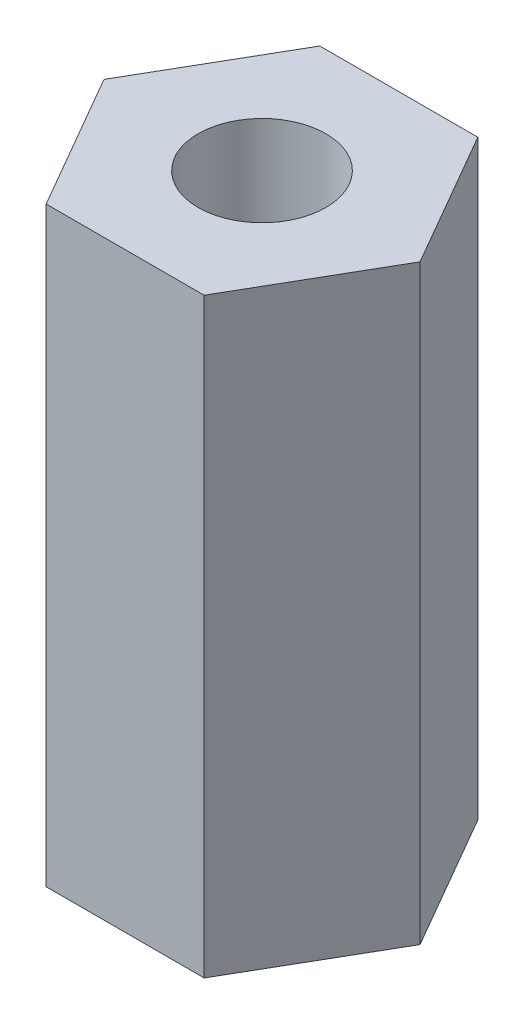
ISO-10303-21;
HEADER;
FILE_DESCRIPTION(('STEP AP214'),'2;1');
FILE_NAME('part.step','',(''),(''),'','','');
FILE_SCHEMA(('AUTOMOTIVE_DESIGN { 1 0 10303 214 1 1 1 1 }'));
ENDSEC;
DATA;
#1=APPLICATION_CONTEXT('core data for automotive mechanical design processes');
#2=APPLICATION_PROTOCOL_DEFINITION('international standard','automotive_design',2000,#1);
#3=PRODUCT_CONTEXT('',#1,'mechanical');
#4=PRODUCT('Part','Part','',(#3));
#5=PRODUCT_RELATED_PRODUCT_CATEGORY('part','',(#4));
#6=PRODUCT_DEFINITION_FORMATION('','',#4);
#7=PRODUCT_DEFINITION_CONTEXT('part definition',#1,'design');
#8=PRODUCT_DEFINITION('design','',#6,#7);
#9=PRODUCT_DEFINITION_SHAPE('','',#8);
#10=(LENGTH_UNIT() NAMED_UNIT(*) SI_UNIT(.MILLI.,.METRE.));
#11=(NAMED_UNIT(*) PLANE_ANGLE_UNIT() SI_UNIT($,.RADIAN.));
#12=(NAMED_UNIT(*) SI_UNIT($,.STERADIAN.) SOLID_ANGLE_UNIT());
#13=UNCERTAINTY_MEASURE_WITH_UNIT(LENGTH_MEASURE(1.E-05),#10,'distance_accuracy_value','');
#14=(GEOMETRIC_REPRESENTATION_CONTEXT(3) GLOBAL_UNCERTAINTY_ASSIGNED_CONTEXT((#13)) GLOBAL_UNIT_ASSIGNED_CONTEXT((#10,
#11,#12)) REPRESENTATION_CONTEXT('',''));
#15=CARTESIAN_POINT('',(0.,0.,0.));
#16=DIRECTION('',(0.,0.,1.));
#17=DIRECTION('',(1.,0.,0.));
#18=AXIS2_PLACEMENT_3D('',#15,#16,#17);
#19=CARTESIAN_POINT('',(0.,0.,0.));
#20=DIRECTION('',(0.,1.,0.));
#21=DIRECTION('',(0.,0.,1.));
#22=AXIS2_PLACEMENT_3D('',#19,#20,#21);
#23=PLANE('',#22);
#24=DIRECTION('',(1.,0.,0.));
#25=VECTOR('',#24,1.);
#26=CARTESIAN_POINT('',(-1.97742467197447,0.,3.425));
#27=LINE('',#26,#25);
#28=CARTESIAN_POINT('',(-1.97742467197447,0.,3.425));
#29=VERTEX_POINT('',#28);
#30=CARTESIAN_POINT('',(1.97742467197447,0.,3.425));
#31=VERTEX_POINT('',#30);
#32=EDGE_CURVE('E140',#29,#31,#27,.T.);
#33=ORIENTED_EDGE('',*,*,#32,.F.);
#34=DIRECTION('',(0.5,0.,0.866025403784439));
#35=VECTOR('',#34,1.);
#36=CARTESIAN_POINT('',(-3.95484934394894,0.,0.));
#37=LINE('',#36,#35);
#38=CARTESIAN_POINT('',(-3.95484934394894,0.,0.));
#39=VERTEX_POINT('',#38);
#40=EDGE_CURVE('E93',#39,#29,#37,.T.);
#41=ORIENTED_EDGE('',*,*,#40,.F.);
#42=DIRECTION('',(-0.5,0.,0.866025403784438));
#43=VECTOR('',#42,1.);
#44=CARTESIAN_POINT('',(-1.97742467197447,0.,-3.425));
#45=LINE('',#44,#43);
#46=CARTESIAN_POINT('',(-1.97742467197447,0.,-3.425));
#47=VERTEX_POINT('',#46);
#48=EDGE_CURVE('E148',#47,#39,#45,.T.);
#49=ORIENTED_EDGE('',*,*,#48,.F.);
#50=DIRECTION('',(-1.,0.,0.));
#51=VECTOR('',#50,1.);
#52=CARTESIAN_POINT('',(1.97742467197447,0.,-3.425));
#53=LINE('',#52,#51);
#54=CARTESIAN_POINT('',(1.97742467197447,0.,-3.425));
#55=VERTEX_POINT('',#54);
#56=EDGE_CURVE('E122',#55,#47,#53,.T.);
#57=ORIENTED_EDGE('',*,*,#56,.F.);
#58=DIRECTION('',(-0.5,0.,-0.866025403784438));
#59=VECTOR('',#58,1.);
#60=CARTESIAN_POINT('',(3.95484934394894,0.,0.));
#61=LINE('',#60,#59);
#62=CARTESIAN_POINT('',(3.95484934394894,0.,0.));
#63=VERTEX_POINT('',#62);
#64=EDGE_CURVE('E141',#63,#55,#61,.T.);
#65=ORIENTED_EDGE('',*,*,#64,.F.);
#66=DIRECTION('',(0.5,0.,-0.866025403784438));
#67=VECTOR('',#66,1.);
#68=CARTESIAN_POINT('',(1.97742467197447,0.,3.425));
#69=LINE('',#68,#67);
#70=EDGE_CURVE('E137',#31,#63,#69,.T.);
#71=ORIENTED_EDGE('',*,*,#70,.F.);
#72=EDGE_LOOP('',(#33,#41,#49,#57,#65,#71));
#73=FACE_BOUND('',#72,.T.);
#74=DIRECTION('',(0.5,0.,0.866025403784439));
#75=VECTOR('',#74,1.);
#76=CARTESIAN_POINT('',(-2.10011160417726,0.,1.2125));
#77=LINE('',#76,#75);
#78=CARTESIAN_POINT('',(-2.80014880556968,0.,0.));
#79=VERTEX_POINT('',#78);
#80=CARTESIAN_POINT('',(-1.40007440278484,0.,2.425));
#81=VERTEX_POINT('',#80);
#82=EDGE_CURVE('E54',#79,#81,#77,.T.);
#83=ORIENTED_EDGE('',*,*,#82,.T.);
#84=DIRECTION('',(1.,0.,0.));
#85=VECTOR('',#84,1.);
#86=CARTESIAN_POINT('',(0.,0.,2.425));
#87=LINE('',#86,#85);
#88=CARTESIAN_POINT('',(1.40007440278484,0.,2.425));
#89=VERTEX_POINT('',#88);
#90=EDGE_CURVE('E198',#81,#89,#87,.T.);
#91=ORIENTED_EDGE('',*,*,#90,.T.);
#92=DIRECTION('',(0.5,0.,-0.866025403784439));
#93=VECTOR('',#92,1.);
#94=CARTESIAN_POINT('',(2.10011160417726,0.,1.2125));
#95=LINE('',#94,#93);
#96=CARTESIAN_POINT('',(2.80014880556968,0.,0.));
#97=VERTEX_POINT('',#96);
#98=EDGE_CURVE('E191',#89,#97,#95,.T.);
#99=ORIENTED_EDGE('',*,*,#98,.T.);
#100=DIRECTION('',(-0.5,0.,-0.866025403784439));
#101=VECTOR('',#100,1.);
#102=CARTESIAN_POINT('',(2.10011160417726,0.,-1.2125));
#103=LINE('',#102,#101);
#104=CARTESIAN_POINT('',(1.40007440278484,0.,-2.425));
#105=VERTEX_POINT('',#104);
#106=EDGE_CURVE('E189',#97,#105,#103,.T.);
#107=ORIENTED_EDGE('',*,*,#106,.T.);
#108=DIRECTION('',(-1.,0.,0.));
#109=VECTOR('',#108,1.);
#110=CARTESIAN_POINT('',(0.,0.,-2.425));
#111=LINE('',#110,#109);
#112=CARTESIAN_POINT('',(-1.40007440278484,0.,-2.425));
#113=VERTEX_POINT('',#112);
#114=EDGE_CURVE('E190',#105,#113,#111,.T.);
#115=ORIENTED_EDGE('',*,*,#114,.T.);
#116=DIRECTION('',(-0.5,0.,0.866025403784439));
#117=VECTOR('',#116,1.);
#118=CARTESIAN_POINT('',(-2.10011160417726,0.,-1.2125));
#119=LINE('',#118,#117);
#120=EDGE_CURVE('E181',#113,#79,#119,.T.);
#121=ORIENTED_EDGE('',*,*,#120,.T.);
#122=EDGE_LOOP('',(#83,#91,#99,#107,#115,#121));
#123=FACE_BOUND('',#122,.T.);
#124=ADVANCED_FACE('F39',(#73,#123),#23,.F.);
#125=CARTESIAN_POINT('',(-1.97742467197447,14.8,3.425));
#126=DIRECTION('',(0.,0.,-1.));
#127=DIRECTION('',(-1.,0.,0.));
#128=AXIS2_PLACEMENT_3D('',#125,#126,#127);
#129=PLANE('',#128);
#130=ORIENTED_EDGE('',*,*,#32,.T.);
#131=DIRECTION('',(0.,-1.,0.));
#132=VECTOR('',#131,1.);
#133=CARTESIAN_POINT('',(1.97742467197447,14.8,3.425));
#134=LINE('',#133,#132);
#135=CARTESIAN_POINT('',(1.97742467197447,14.8,3.425));
#136=VERTEX_POINT('',#135);
#137=EDGE_CURVE('E11',#136,#31,#134,.T.);
#138=ORIENTED_EDGE('',*,*,#137,.F.);
#139=DIRECTION('',(1.,0.,0.));
#140=VECTOR('',#139,1.);
#141=CARTESIAN_POINT('',(-1.97742467197447,14.8,3.425));
#142=LINE('',#141,#140);
#143=CARTESIAN_POINT('',(-1.97742467197447,14.8,3.425));
#144=VERTEX_POINT('',#143);
#145=EDGE_CURVE('E149',#144,#136,#142,.T.);
#146=ORIENTED_EDGE('',*,*,#145,.F.);
#147=DIRECTION('',(0.,-1.,0.));
#148=VECTOR('',#147,1.);
#149=CARTESIAN_POINT('',(-1.97742467197447,14.8,3.425));
#150=LINE('',#149,#148);
#151=EDGE_CURVE('E131',#144,#29,#150,.T.);
#152=ORIENTED_EDGE('',*,*,#151,.T.);
#153=EDGE_LOOP('',(#130,#138,#146,#152));
#154=FACE_BOUND('',#153,.T.);
#155=ADVANCED_FACE('F41',(#154),#129,.F.);
#156=CARTESIAN_POINT('',(1.97742467197447,14.8,3.425));
#157=DIRECTION('',(-0.866025403784438,0.,-0.5));
#158=DIRECTION('',(-0.5,0.,0.866025403784438));
#159=AXIS2_PLACEMENT_3D('',#156,#157,#158);
#160=PLANE('',#159);
#161=ORIENTED_EDGE('',*,*,#70,.T.);
#162=DIRECTION('',(0.,-1.,0.));
#163=VECTOR('',#162,1.);
#164=CARTESIAN_POINT('',(3.95484934394894,14.8,0.));
#165=LINE('',#164,#163);
#166=CARTESIAN_POINT('',(3.95484934394894,14.8,0.));
#167=VERTEX_POINT('',#166);
#168=EDGE_CURVE('E48',#167,#63,#165,.T.);
#169=ORIENTED_EDGE('',*,*,#168,.F.);
#170=DIRECTION('',(0.5,0.,-0.866025403784438));
#171=VECTOR('',#170,1.);
#172=CARTESIAN_POINT('',(1.97742467197447,14.8,3.425));
#173=LINE('',#172,#171);
#174=EDGE_CURVE('E97',#136,#167,#173,.T.);
#175=ORIENTED_EDGE('',*,*,#174,.F.);
#176=ORIENTED_EDGE('',*,*,#137,.T.);
#177=EDGE_LOOP('',(#161,#169,#175,#176));
#178=FACE_BOUND('',#177,.T.);
#179=ADVANCED_FACE('F243',(#178),#160,.F.);
#180=CARTESIAN_POINT('',(3.95484934394894,14.8,0.));
#181=DIRECTION('',(-0.866025403784438,0.,0.5));
#182=DIRECTION('',(0.5,0.,0.866025403784438));
#183=AXIS2_PLACEMENT_3D('',#180,#181,#182);
#184=PLANE('',#183);
#185=ORIENTED_EDGE('',*,*,#64,.T.);
#186=DIRECTION('',(0.,-1.,0.));
#187=VECTOR('',#186,1.);
#188=CARTESIAN_POINT('',(1.97742467197447,14.8,-3.425));
#189=LINE('',#188,#187);
#190=CARTESIAN_POINT('',(1.97742467197447,14.8,-3.425));
#191=VERTEX_POINT('',#190);
#192=EDGE_CURVE('E126',#191,#55,#189,.T.);
#193=ORIENTED_EDGE('',*,*,#192,.F.);
#194=DIRECTION('',(-0.5,0.,-0.866025403784438));
#195=VECTOR('',#194,1.);
#196=CARTESIAN_POINT('',(3.95484934394894,14.8,0.));
#197=LINE('',#196,#195);
#198=EDGE_CURVE('E118',#167,#191,#197,.T.);
#199=ORIENTED_EDGE('',*,*,#198,.F.);
#200=ORIENTED_EDGE('',*,*,#168,.T.);
#201=EDGE_LOOP('',(#185,#193,#199,#200));
#202=FACE_BOUND('',#201,.T.);
#203=ADVANCED_FACE('F156',(#202),#184,.F.);
#204=CARTESIAN_POINT('',(1.97742467197447,14.8,-3.425));
#205=DIRECTION('',(0.,0.,1.));
#206=DIRECTION('',(1.,0.,0.));
#207=AXIS2_PLACEMENT_3D('',#204,#205,#206);
#208=PLANE('',#207);
#209=ORIENTED_EDGE('',*,*,#56,.T.);
#210=DIRECTION('',(0.,-1.,0.));
#211=VECTOR('',#210,1.);
#212=CARTESIAN_POINT('',(-1.97742467197447,14.8,-3.425));
#213=LINE('',#212,#211);
#214=CARTESIAN_POINT('',(-1.97742467197447,14.8,-3.425));
#215=VERTEX_POINT('',#214);
#216=EDGE_CURVE('E125',#215,#47,#213,.T.);
#217=ORIENTED_EDGE('',*,*,#216,.F.);
#218=DIRECTION('',(-1.,0.,0.));
#219=VECTOR('',#218,1.);
#220=CARTESIAN_POINT('',(1.97742467197447,14.8,-3.425));
#221=LINE('',#220,#219);
#222=EDGE_CURVE('E108',#191,#215,#221,.T.);
#223=ORIENTED_EDGE('',*,*,#222,.F.);
#224=ORIENTED_EDGE('',*,*,#192,.T.);
#225=EDGE_LOOP('',(#209,#217,#223,#224));
#226=FACE_BOUND('',#225,.T.);
#227=ADVANCED_FACE('F121',(#226),#208,.F.);
#228=CARTESIAN_POINT('',(-1.97742467197447,14.8,-3.425));
#229=DIRECTION('',(0.866025403784438,0.,0.5));
#230=DIRECTION('',(0.5,0.,-0.866025403784439));
#231=AXIS2_PLACEMENT_3D('',#228,#229,#230);
#232=PLANE('',#231);
#233=ORIENTED_EDGE('',*,*,#48,.T.);
#234=DIRECTION('',(0.,-1.,0.));
#235=VECTOR('',#234,1.);
#236=CARTESIAN_POINT('',(-3.95484934394894,14.8,0.));
#237=LINE('',#236,#235);
#238=CARTESIAN_POINT('',(-3.95484934394894,14.8,0.));
#239=VERTEX_POINT('',#238);
#240=EDGE_CURVE('E129',#239,#39,#237,.T.);
#241=ORIENTED_EDGE('',*,*,#240,.F.);
#242=DIRECTION('',(-0.5,0.,0.866025403784438));
#243=VECTOR('',#242,1.);
#244=CARTESIAN_POINT('',(-1.97742467197447,14.8,-3.425));
#245=LINE('',#244,#243);
#246=EDGE_CURVE('E114',#215,#239,#245,.T.);
#247=ORIENTED_EDGE('',*,*,#246,.F.);
#248=ORIENTED_EDGE('',*,*,#216,.T.);
#249=EDGE_LOOP('',(#233,#241,#247,#248));
#250=FACE_BOUND('',#249,.T.);
#251=ADVANCED_FACE('F133',(#250),#232,.F.);
#252=CARTESIAN_POINT('',(-3.95484934394894,14.8,0.));
#253=DIRECTION('',(0.866025403784439,0.,-0.5));
#254=DIRECTION('',(-0.5,0.,-0.866025403784439));
#255=AXIS2_PLACEMENT_3D('',#252,#253,#254);
#256=PLANE('',#255);
#257=ORIENTED_EDGE('',*,*,#40,.T.);
#258=ORIENTED_EDGE('',*,*,#151,.F.);
#259=DIRECTION('',(0.5,0.,0.866025403784439));
#260=VECTOR('',#259,1.);
#261=CARTESIAN_POINT('',(-3.95484934394894,14.8,0.));
#262=LINE('',#261,#260);
#263=EDGE_CURVE('E62',#239,#144,#262,.T.);
#264=ORIENTED_EDGE('',*,*,#263,.F.);
#265=ORIENTED_EDGE('',*,*,#240,.T.);
#266=EDGE_LOOP('',(#257,#258,#264,#265));
#267=FACE_BOUND('',#266,.T.);
#268=ADVANCED_FACE('F159',(#267),#256,.F.);
#269=CARTESIAN_POINT('',(0.,14.8,0.));
#270=DIRECTION('',(0.,1.,0.));
#271=DIRECTION('',(0.,0.,1.));
#272=AXIS2_PLACEMENT_3D('',#269,#270,#271);
#273=PLANE('',#272);
#274=CARTESIAN_POINT('',(0.,14.8,0.));
#275=DIRECTION('',(0.,1.,0.));
#276=DIRECTION('',(0.,0.,1.));
#277=AXIS2_PLACEMENT_3D('',#274,#275,#276);
#278=CIRCLE('',#277,1.6);
#279=CARTESIAN_POINT('',(0.,14.8,1.6));
#280=VERTEX_POINT('',#279);
#281=EDGE_CURVE('E216',#280,#280,#278,.T.);
#282=ORIENTED_EDGE('',*,*,#281,.F.);
#283=EDGE_LOOP('',(#282));
#284=FACE_BOUND('',#283,.T.);
#285=ORIENTED_EDGE('',*,*,#145,.T.);
#286=ORIENTED_EDGE('',*,*,#174,.T.);
#287=ORIENTED_EDGE('',*,*,#198,.T.);
#288=ORIENTED_EDGE('',*,*,#222,.T.);
#289=ORIENTED_EDGE('',*,*,#246,.T.);
#290=ORIENTED_EDGE('',*,*,#263,.T.);
#291=EDGE_LOOP('',(#285,#286,#287,#288,#289,#290));
#292=FACE_BOUND('',#291,.T.);
#293=ADVANCED_FACE('F112',(#284,#292),#273,.T.);
#294=CARTESIAN_POINT('',(-2.10011160417726,10.05,1.2125));
#295=DIRECTION('',(0.866025403784439,0.,-0.5));
#296=DIRECTION('',(-0.5,0.,-0.866025403784439));
#297=AXIS2_PLACEMENT_3D('',#294,#295,#296);
#298=PLANE('',#297);
#299=ORIENTED_EDGE('',*,*,#82,.F.);
#300=DIRECTION('',(0.,-1.,0.));
#301=VECTOR('',#300,1.);
#302=CARTESIAN_POINT('',(-2.80014880556968,10.05,0.));
#303=LINE('',#302,#301);
#304=CARTESIAN_POINT('',(-2.80014880556968,10.05,0.));
#305=VERTEX_POINT('',#304);
#306=EDGE_CURVE('E177',#305,#79,#303,.T.);
#307=ORIENTED_EDGE('',*,*,#306,.F.);
#308=DIRECTION('',(0.5,0.,0.866025403784439));
#309=VECTOR('',#308,1.);
#310=CARTESIAN_POINT('',(-2.10011160417726,10.05,1.2125));
#311=LINE('',#310,#309);
#312=CARTESIAN_POINT('',(-1.40007440278484,10.05,2.425));
#313=VERTEX_POINT('',#312);
#314=EDGE_CURVE('E188',#305,#313,#311,.T.);
#315=ORIENTED_EDGE('',*,*,#314,.T.);
#316=DIRECTION('',(0.,-1.,0.));
#317=VECTOR('',#316,1.);
#318=CARTESIAN_POINT('',(-1.40007440278484,10.05,2.425));
#319=LINE('',#318,#317);
#320=EDGE_CURVE('E143',#313,#81,#319,.T.);
#321=ORIENTED_EDGE('',*,*,#320,.T.);
#322=EDGE_LOOP('',(#299,#307,#315,#321));
#323=FACE_BOUND('',#322,.T.);
#324=ADVANCED_FACE('F288',(#323),#298,.T.);
#325=CARTESIAN_POINT('',(0.,10.05,2.425));
#326=DIRECTION('',(0.,0.,-1.));
#327=DIRECTION('',(-1.,0.,0.));
#328=AXIS2_PLACEMENT_3D('',#325,#326,#327);
#329=PLANE('',#328);
#330=ORIENTED_EDGE('',*,*,#90,.F.);
#331=ORIENTED_EDGE('',*,*,#320,.F.);
#332=DIRECTION('',(1.,0.,0.));
#333=VECTOR('',#332,1.);
#334=CARTESIAN_POINT('',(0.,10.05,2.425));
#335=LINE('',#334,#333);
#336=CARTESIAN_POINT('',(1.40007440278484,10.05,2.425));
#337=VERTEX_POINT('',#336);
#338=EDGE_CURVE('E211',#313,#337,#335,.T.);
#339=ORIENTED_EDGE('',*,*,#338,.T.);
#340=DIRECTION('',(0.,-1.,0.));
#341=VECTOR('',#340,1.);
#342=CARTESIAN_POINT('',(1.40007440278484,10.05,2.425));
#343=LINE('',#342,#341);
#344=EDGE_CURVE('E169',#337,#89,#343,.T.);
#345=ORIENTED_EDGE('',*,*,#344,.T.);
#346=EDGE_LOOP('',(#330,#331,#339,#345));
#347=FACE_BOUND('',#346,.T.);
#348=ADVANCED_FACE('F297',(#347),#329,.T.);
#349=CARTESIAN_POINT('',(2.10011160417726,10.05,1.2125));
#350=DIRECTION('',(-0.866025403784439,0.,-0.5));
#351=DIRECTION('',(-0.5,0.,0.866025403784439));
#352=AXIS2_PLACEMENT_3D('',#349,#350,#351);
#353=PLANE('',#352);
#354=ORIENTED_EDGE('',*,*,#98,.F.);
#355=ORIENTED_EDGE('',*,*,#344,.F.);
#356=DIRECTION('',(0.5,0.,-0.866025403784439));
#357=VECTOR('',#356,1.);
#358=CARTESIAN_POINT('',(2.10011160417726,10.05,1.2125));
#359=LINE('',#358,#357);
#360=CARTESIAN_POINT('',(2.80014880556968,10.05,0.));
#361=VERTEX_POINT('',#360);
#362=EDGE_CURVE('E208',#337,#361,#359,.T.);
#363=ORIENTED_EDGE('',*,*,#362,.T.);
#364=DIRECTION('',(0.,-1.,0.));
#365=VECTOR('',#364,1.);
#366=CARTESIAN_POINT('',(2.80014880556968,10.05,0.));
#367=LINE('',#366,#365);
#368=EDGE_CURVE('E173',#361,#97,#367,.T.);
#369=ORIENTED_EDGE('',*,*,#368,.T.);
#370=EDGE_LOOP('',(#354,#355,#363,#369));
#371=FACE_BOUND('',#370,.T.);
#372=ADVANCED_FACE('F307',(#371),#353,.T.);
#373=CARTESIAN_POINT('',(2.10011160417726,10.05,-1.2125));
#374=DIRECTION('',(-0.866025403784438,0.,0.5));
#375=DIRECTION('',(0.5,0.,0.866025403784439));
#376=AXIS2_PLACEMENT_3D('',#373,#374,#375);
#377=PLANE('',#376);
#378=ORIENTED_EDGE('',*,*,#106,.F.);
#379=ORIENTED_EDGE('',*,*,#368,.F.);
#380=DIRECTION('',(-0.5,0.,-0.866025403784439));
#381=VECTOR('',#380,1.);
#382=CARTESIAN_POINT('',(2.10011160417726,10.05,-1.2125));
#383=LINE('',#382,#381);
#384=CARTESIAN_POINT('',(1.40007440278484,10.05,-2.425));
#385=VERTEX_POINT('',#384);
#386=EDGE_CURVE('E202',#361,#385,#383,.T.);
#387=ORIENTED_EDGE('',*,*,#386,.T.);
#388=DIRECTION('',(0.,-1.,0.));
#389=VECTOR('',#388,1.);
#390=CARTESIAN_POINT('',(1.40007440278484,10.05,-2.425));
#391=LINE('',#390,#389);
#392=EDGE_CURVE('E172',#385,#105,#391,.T.);
#393=ORIENTED_EDGE('',*,*,#392,.T.);
#394=EDGE_LOOP('',(#378,#379,#387,#393));
#395=FACE_BOUND('',#394,.T.);
#396=ADVANCED_FACE('F320',(#395),#377,.T.);
#397=CARTESIAN_POINT('',(0.,10.05,-2.425));
#398=DIRECTION('',(0.,0.,1.));
#399=DIRECTION('',(1.,0.,0.));
#400=AXIS2_PLACEMENT_3D('',#397,#398,#399);
#401=PLANE('',#400);
#402=ORIENTED_EDGE('',*,*,#114,.F.);
#403=ORIENTED_EDGE('',*,*,#392,.F.);
#404=DIRECTION('',(-1.,0.,0.));
#405=VECTOR('',#404,1.);
#406=CARTESIAN_POINT('',(0.,10.05,-2.425));
#407=LINE('',#406,#405);
#408=CARTESIAN_POINT('',(-1.40007440278484,10.05,-2.425));
#409=VERTEX_POINT('',#408);
#410=EDGE_CURVE('E205',#385,#409,#407,.T.);
#411=ORIENTED_EDGE('',*,*,#410,.T.);
#412=DIRECTION('',(0.,-1.,0.));
#413=VECTOR('',#412,1.);
#414=CARTESIAN_POINT('',(-1.40007440278484,10.05,-2.425));
#415=LINE('',#414,#413);
#416=EDGE_CURVE('E180',#409,#113,#415,.T.);
#417=ORIENTED_EDGE('',*,*,#416,.T.);
#418=EDGE_LOOP('',(#402,#403,#411,#417));
#419=FACE_BOUND('',#418,.T.);
#420=ADVANCED_FACE('F330',(#419),#401,.T.);
#421=CARTESIAN_POINT('',(-2.10011160417726,10.05,-1.2125));
#422=DIRECTION('',(0.866025403784439,0.,0.5));
#423=DIRECTION('',(0.5,0.,-0.866025403784439));
#424=AXIS2_PLACEMENT_3D('',#421,#422,#423);
#425=PLANE('',#424);
#426=ORIENTED_EDGE('',*,*,#120,.F.);
#427=ORIENTED_EDGE('',*,*,#416,.F.);
#428=DIRECTION('',(-0.5,0.,0.866025403784439));
#429=VECTOR('',#428,1.);
#430=CARTESIAN_POINT('',(-2.10011160417726,10.05,-1.2125));
#431=LINE('',#430,#429);
#432=EDGE_CURVE('E185',#409,#305,#431,.T.);
#433=ORIENTED_EDGE('',*,*,#432,.T.);
#434=ORIENTED_EDGE('',*,*,#306,.T.);
#435=EDGE_LOOP('',(#426,#427,#433,#434));
#436=FACE_BOUND('',#435,.T.);
#437=ADVANCED_FACE('F235',(#436),#425,.T.);
#438=CARTESIAN_POINT('',(0.,10.05,0.));
#439=DIRECTION('',(0.,1.,0.));
#440=DIRECTION('',(0.,0.,1.));
#441=AXIS2_PLACEMENT_3D('',#438,#439,#440);
#442=PLANE('',#441);
#443=CARTESIAN_POINT('',(0.,10.05,0.));
#444=DIRECTION('',(0.,1.,0.));
#445=DIRECTION('',(0.,0.,1.));
#446=AXIS2_PLACEMENT_3D('',#443,#444,#445);
#447=CIRCLE('',#446,1.6);
#448=CARTESIAN_POINT('',(0.,10.05,1.6));
#449=VERTEX_POINT('',#448);
#450=EDGE_CURVE('E43',#449,#449,#447,.T.);
#451=ORIENTED_EDGE('',*,*,#450,.T.);
#452=EDGE_LOOP('',(#451));
#453=FACE_BOUND('',#452,.T.);
#454=ORIENTED_EDGE('',*,*,#314,.F.);
#455=ORIENTED_EDGE('',*,*,#432,.F.);
#456=ORIENTED_EDGE('',*,*,#410,.F.);
#457=ORIENTED_EDGE('',*,*,#386,.F.);
#458=ORIENTED_EDGE('',*,*,#362,.F.);
#459=ORIENTED_EDGE('',*,*,#338,.F.);
#460=EDGE_LOOP('',(#454,#455,#456,#457,#458,#459));
#461=FACE_BOUND('',#460,.T.);
#462=ADVANCED_FACE('F224',(#453,#461),#442,.F.);
#463=CARTESIAN_POINT('',(0.,9.8,0.));
#464=DIRECTION('',(0.,1.,0.));
#465=DIRECTION('',(0.,0.,1.));
#466=AXIS2_PLACEMENT_3D('',#463,#464,#465);
#467=CYLINDRICAL_SURFACE('',#466,1.6);
#468=ORIENTED_EDGE('',*,*,#281,.T.);
#469=EDGE_LOOP('',(#468));
#470=FACE_BOUND('',#469,.T.);
#471=ORIENTED_EDGE('',*,*,#450,.F.);
#472=EDGE_LOOP('',(#471));
#473=FACE_BOUND('',#472,.T.);
#474=ADVANCED_FACE('F228',(#470,#473),#467,.F.);
#475=CLOSED_SHELL('',(#124,#155,#179,#203,#227,#251,#268,#293,#324,#348,#372,#396,#420,#437,
#462,#474));
#476=MANIFOLD_SOLID_BREP('B2',#475);
#477=ADVANCED_BREP_SHAPE_REPRESENTATION('',(#18,#476),#14);
#478=SHAPE_DEFINITION_REPRESENTATION(#9,#477);
ENDSEC;
END-ISO-10303-21;
